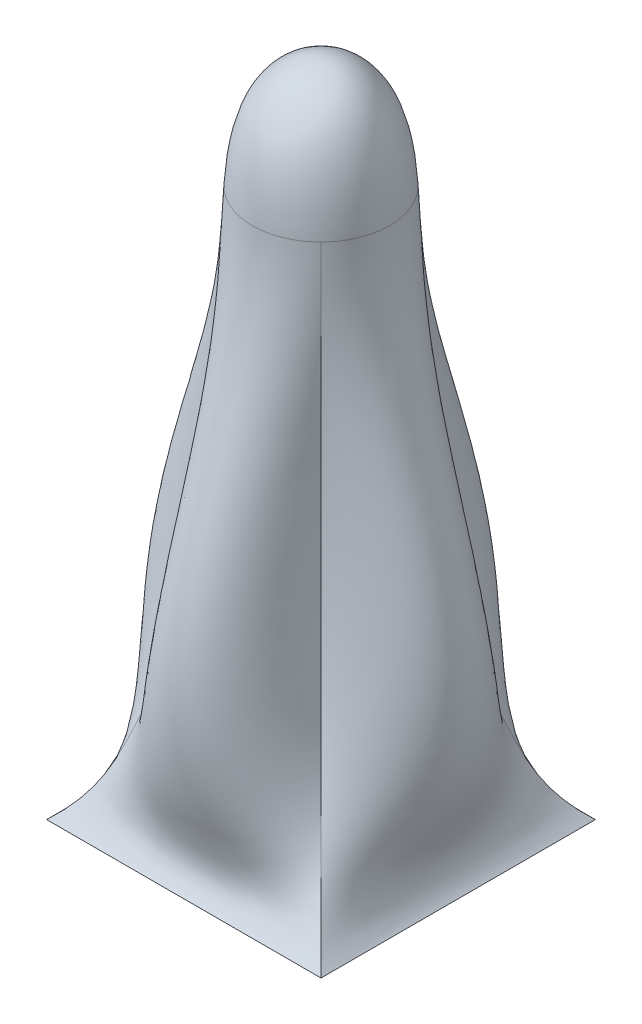
ISO-10303-21;
HEADER;
FILE_DESCRIPTION(('STEP AP214'),'2;1');
FILE_NAME('part.step','',(''),(''),'','','');
FILE_SCHEMA(('AUTOMOTIVE_DESIGN { 1 0 10303 214 1 1 1 1 }'));
ENDSEC;
DATA;
#1=APPLICATION_CONTEXT('core data for automotive mechanical design processes');
#2=APPLICATION_PROTOCOL_DEFINITION('international standard','automotive_design',2000,#1);
#3=PRODUCT_CONTEXT('',#1,'mechanical');
#4=PRODUCT('Part','Part','',(#3));
#5=PRODUCT_RELATED_PRODUCT_CATEGORY('part','',(#4));
#6=PRODUCT_DEFINITION_FORMATION('','',#4);
#7=PRODUCT_DEFINITION_CONTEXT('part definition',#1,'design');
#8=PRODUCT_DEFINITION('design','',#6,#7);
#9=PRODUCT_DEFINITION_SHAPE('','',#8);
#10=(LENGTH_UNIT() NAMED_UNIT(*) SI_UNIT(.MILLI.,.METRE.));
#11=(NAMED_UNIT(*) PLANE_ANGLE_UNIT() SI_UNIT($,.RADIAN.));
#12=(NAMED_UNIT(*) SI_UNIT($,.STERADIAN.) SOLID_ANGLE_UNIT());
#13=UNCERTAINTY_MEASURE_WITH_UNIT(LENGTH_MEASURE(1.E-05),#10,'distance_accuracy_value','');
#14=(GEOMETRIC_REPRESENTATION_CONTEXT(3) GLOBAL_UNCERTAINTY_ASSIGNED_CONTEXT((#13)) GLOBAL_UNIT_ASSIGNED_CONTEXT((#10,
#11,#12)) REPRESENTATION_CONTEXT('',''));
#15=CARTESIAN_POINT('',(0.,0.,0.));
#16=DIRECTION('',(0.,0.,1.));
#17=DIRECTION('',(1.,0.,0.));
#18=AXIS2_PLACEMENT_3D('',#15,#16,#17);
#19=CARTESIAN_POINT('',(0.,0.,0.));
#20=DIRECTION('',(0.,-1.,0.));
#21=DIRECTION('',(0.,0.,-1.));
#22=AXIS2_PLACEMENT_3D('',#19,#20,#21);
#23=PLANE('',#22);
#24=DIRECTION('',(0.,0.,-1.));
#25=VECTOR('',#24,1.);
#26=CARTESIAN_POINT('',(6.35,0.,6.35));
#27=LINE('',#26,#25);
#28=CARTESIAN_POINT('',(6.35,0.,6.35));
#29=VERTEX_POINT('',#28);
#30=CARTESIAN_POINT('',(6.35,0.,-6.35));
#31=VERTEX_POINT('',#30);
#32=EDGE_CURVE('E232',#29,#31,#27,.T.);
#33=ORIENTED_EDGE('',*,*,#32,.F.);
#34=DIRECTION('',(1.,0.,0.));
#35=VECTOR('',#34,1.);
#36=CARTESIAN_POINT('',(-6.35,0.,6.35));
#37=LINE('',#36,#35);
#38=CARTESIAN_POINT('',(-6.35,0.,6.35));
#39=VERTEX_POINT('',#38);
#40=EDGE_CURVE('E214',#39,#29,#37,.T.);
#41=ORIENTED_EDGE('',*,*,#40,.F.);
#42=DIRECTION('',(0.,0.,1.));
#43=VECTOR('',#42,1.);
#44=CARTESIAN_POINT('',(-6.35,0.,6.35));
#45=LINE('',#44,#43);
#46=CARTESIAN_POINT('',(-6.35,0.,-6.35));
#47=VERTEX_POINT('',#46);
#48=EDGE_CURVE('E206',#47,#39,#45,.T.);
#49=ORIENTED_EDGE('',*,*,#48,.F.);
#50=DIRECTION('',(-1.,0.,0.));
#51=VECTOR('',#50,1.);
#52=CARTESIAN_POINT('',(-6.35,0.,-6.35));
#53=LINE('',#52,#51);
#54=EDGE_CURVE('E210',#31,#47,#53,.T.);
#55=ORIENTED_EDGE('',*,*,#54,.F.);
#56=EDGE_LOOP('',(#33,#41,#49,#55));
#57=FACE_BOUND('',#56,.T.);
#58=ADVANCED_FACE('F161',(#57),#23,.T.);
#59=CARTESIAN_POINT('',(-6.35,0.,6.35));
#60=CARTESIAN_POINT('',(-5.30330193062769,0.920473673417694,5.30330193062769));
#61=CARTESIAN_POINT('',(-2.14481905701201,8.9175110041226,2.14481905701201));
#62=CARTESIAN_POINT('',(-2.56812426062388,17.853807006751,2.56812426062387));
#63=CARTESIAN_POINT('',(-2.24723349499428,25.4,2.24723349499428));
#64=CARTESIAN_POINT('',(-2.11666666666667,0.,6.35));
#65=CARTESIAN_POINT('',(-1.76776731020923,0.920473673417694,5.30330193062769));
#66=CARTESIAN_POINT('',(-2.83613051937453,8.9175110041226,12.3469990799866));
#67=CARTESIAN_POINT('',(-1.11391518684819,17.853807006751,3.80840615731316));
#68=CARTESIAN_POINT('',(-1.00695159830499,25.4,3.48751539168357));
#69=CARTESIAN_POINT('',(2.11666666666667,0.,6.35));
#70=CARTESIAN_POINT('',(1.76776731020923,0.920473673417694,5.30330193062769));
#71=CARTESIAN_POINT('',(2.83613051937451,8.9175110041226,12.3469990799866));
#72=CARTESIAN_POINT('',(1.11391518684819,17.853807006751,3.80840615731317));
#73=CARTESIAN_POINT('',(1.00695159830499,25.4,3.48751539168357));
#74=CARTESIAN_POINT('',(6.35,0.,6.35));
#75=CARTESIAN_POINT('',(5.30330193062769,0.920473673417694,5.30330193062769));
#76=CARTESIAN_POINT('',(2.14481905701201,8.9175110041226,2.14481905701201));
#77=CARTESIAN_POINT('',(2.56812426062387,17.853807006751,2.56812426062388));
#78=CARTESIAN_POINT('',(2.24723349499428,25.4,2.24723349499428));
#79=B_SPLINE_SURFACE_WITH_KNOTS('',3,3,((#59,#60,#61,#62,#63),(#64,#65,#66,#67,#68),(#69,#70,
#71,#72,#73),(#74,#75,#76,#77,#78)),.UNSPECIFIED.,.F.,.F.,.F.,(4,4),(4,1,4),(0.,1.),(0.,
0.139812166050217,1.),.UNSPECIFIED.);
#80=CARTESIAN_POINT('',(6.35,0.,6.35));
#81=CARTESIAN_POINT('',(5.30330193062769,0.920473673417694,5.30330193062769));
#82=CARTESIAN_POINT('',(2.14481905701201,8.9175110041226,2.14481905701201));
#83=CARTESIAN_POINT('',(2.56812426062387,17.853807006751,2.56812426062388));
#84=CARTESIAN_POINT('',(2.24723349499428,25.4,2.24723349499428));
#85=B_SPLINE_CURVE_WITH_KNOTS('',3,(#80,#81,#82,#83,#84),.UNSPECIFIED.,.F.,.F.,(4,1,4),(0.,
0.139812166050217,1.),.UNSPECIFIED.);
#86=CARTESIAN_POINT('',(2.24730705049781,25.4000230410495,2.24730705145861));
#87=VERTEX_POINT('',#86);
#88=EDGE_CURVE('E239',#29,#87,#85,.T.);
#89=CARTESIAN_POINT('',(0.,25.4,0.));
#90=DIRECTION('',(0.,1.,0.));
#91=DIRECTION('',(0.,0.,1.));
#92=AXIS2_PLACEMENT_3D('',#89,#90,#91);
#93=CIRCLE('',#92,3.17806808644);
#94=CARTESIAN_POINT('',(-2.24730705060792,25.4000230410994,2.24730705136029));
#95=VERTEX_POINT('',#94);
#96=EDGE_CURVE('E174',#95,#87,#93,.T.);
#97=CARTESIAN_POINT('',(-6.35,0.,6.35));
#98=CARTESIAN_POINT('',(-5.30330193062769,0.920473673417694,5.30330193062769));
#99=CARTESIAN_POINT('',(-2.14481905701201,8.9175110041226,2.14481905701201));
#100=CARTESIAN_POINT('',(-2.56812426062388,17.853807006751,2.56812426062387));
#101=CARTESIAN_POINT('',(-2.24723349499428,25.4,2.24723349499428));
#102=B_SPLINE_CURVE_WITH_KNOTS('',3,(#97,#98,#99,#100,#101),.UNSPECIFIED.,.F.,.F.,(4,1,4),(0.,
0.139812166050217,1.),.UNSPECIFIED.);
#103=EDGE_CURVE('E378',#95,#39,#102,.F.);
#104=ORIENTED_EDGE('',*,*,#40,.T.);
#105=ORIENTED_EDGE('',*,*,#88,.T.);
#106=ORIENTED_EDGE('',*,*,#96,.F.);
#107=ORIENTED_EDGE('',*,*,#103,.T.);
#108=EDGE_LOOP('',(#104,#105,#106,#107));
#109=FACE_BOUND('',#108,.T.);
#110=ADVANCED_FACE('F354',(#109),#79,.T.);
#111=CARTESIAN_POINT('',(6.35,0.,6.35));
#112=CARTESIAN_POINT('',(5.30330193062769,0.920473673417694,5.30330193062769));
#113=CARTESIAN_POINT('',(2.14481905701201,8.9175110041226,2.14481905701201));
#114=CARTESIAN_POINT('',(2.56812426062387,17.853807006751,2.56812426062387));
#115=CARTESIAN_POINT('',(2.24723349499428,25.4,2.24723349499428));
#116=CARTESIAN_POINT('',(6.35,0.,2.11666666666667));
#117=CARTESIAN_POINT('',(5.30330193062769,0.920473673417694,1.76776731020923));
#118=CARTESIAN_POINT('',(12.3469990799866,8.9175110041226,2.83613051937452));
#119=CARTESIAN_POINT('',(3.80840615731317,17.853807006751,1.11391518684819));
#120=CARTESIAN_POINT('',(3.48751539168357,25.4,1.00695159830499));
#121=CARTESIAN_POINT('',(6.35,0.,-2.11666666666667));
#122=CARTESIAN_POINT('',(5.30330193062769,0.920473673417694,-1.76776731020923));
#123=CARTESIAN_POINT('',(12.3469990799866,8.9175110041226,-2.83613051937452));
#124=CARTESIAN_POINT('',(3.80840615731317,17.853807006751,-1.11391518684819));
#125=CARTESIAN_POINT('',(3.48751539168357,25.4,-1.00695159830499));
#126=CARTESIAN_POINT('',(6.35,0.,-6.35));
#127=CARTESIAN_POINT('',(5.30330193062769,0.920473673417694,-5.30330193062769));
#128=CARTESIAN_POINT('',(2.14481905701201,8.9175110041226,-2.14481905701201));
#129=CARTESIAN_POINT('',(2.56812426062387,17.853807006751,-2.56812426062387));
#130=CARTESIAN_POINT('',(2.24723349499428,25.4,-2.24723349499428));
#131=B_SPLINE_SURFACE_WITH_KNOTS('',3,3,((#111,#112,#113,#114,#115),(#116,#117,#118,#119,#120),
(#121,#122,#123,#124,#125),(#126,#127,#128,#129,#130)),.UNSPECIFIED.,.F.,.F.,.F.,(4,4),(4,1,4),
(0.,1.),(0.,0.139812166050217,1.),.UNSPECIFIED.);
#132=CARTESIAN_POINT('',(6.35,0.,-6.35));
#133=CARTESIAN_POINT('',(5.30330193062769,0.920473673417694,-5.30330193062769));
#134=CARTESIAN_POINT('',(2.14481905701201,8.9175110041226,-2.14481905701201));
#135=CARTESIAN_POINT('',(2.56812426062387,17.853807006751,-2.56812426062387));
#136=CARTESIAN_POINT('',(2.24723349499428,25.4,-2.24723349499428));
#137=B_SPLINE_CURVE_WITH_KNOTS('',3,(#132,#133,#134,#135,#136),.UNSPECIFIED.,.F.,.F.,(4,1,4),
(0.,0.139812166050217,1.),.UNSPECIFIED.);
#138=CARTESIAN_POINT('',(2.24730705087547,25.40002304108,-2.24730705171474));
#139=VERTEX_POINT('',#138);
#140=EDGE_CURVE('E231',#31,#139,#137,.T.);
#141=EDGE_CURVE('E182',#87,#139,#93,.T.);
#142=ORIENTED_EDGE('',*,*,#32,.T.);
#143=ORIENTED_EDGE('',*,*,#140,.T.);
#144=ORIENTED_EDGE('',*,*,#141,.F.);
#145=ORIENTED_EDGE('',*,*,#88,.F.);
#146=EDGE_LOOP('',(#142,#143,#144,#145));
#147=FACE_BOUND('',#146,.T.);
#148=ADVANCED_FACE('F266',(#147),#131,.T.);
#149=CARTESIAN_POINT('',(-6.35,0.,-6.35));
#150=CARTESIAN_POINT('',(-5.30330193062769,0.920473673417694,-5.30330193062769));
#151=CARTESIAN_POINT('',(-2.14481905701201,8.9175110041226,-2.14481905701201));
#152=CARTESIAN_POINT('',(-2.56812426062387,17.853807006751,-2.56812426062387));
#153=CARTESIAN_POINT('',(-2.24723349499428,25.4,-2.24723349499428));
#154=CARTESIAN_POINT('',(-6.35,0.,-2.11666666666667));
#155=CARTESIAN_POINT('',(-5.30330193062769,0.920473673417694,-1.76776731020923));
#156=CARTESIAN_POINT('',(-12.3469990799866,8.9175110041226,-2.83613051937453));
#157=CARTESIAN_POINT('',(-3.80840615731316,17.853807006751,-1.11391518684819));
#158=CARTESIAN_POINT('',(-3.48751539168357,25.4,-1.00695159830499));
#159=CARTESIAN_POINT('',(-6.35,0.,2.11666666666667));
#160=CARTESIAN_POINT('',(-5.30330193062769,0.920473673417694,1.76776731020923));
#161=CARTESIAN_POINT('',(-12.3469990799866,8.9175110041226,2.83613051937452));
#162=CARTESIAN_POINT('',(-3.80840615731317,17.853807006751,1.11391518684819));
#163=CARTESIAN_POINT('',(-3.48751539168357,25.4,1.00695159830499));
#164=CARTESIAN_POINT('',(-6.35,0.,6.35));
#165=CARTESIAN_POINT('',(-5.30330193062769,0.920473673417694,5.30330193062769));
#166=CARTESIAN_POINT('',(-2.14481905701201,8.9175110041226,2.14481905701201));
#167=CARTESIAN_POINT('',(-2.56812426062387,17.853807006751,2.56812426062387));
#168=CARTESIAN_POINT('',(-2.24723349499428,25.4,2.24723349499428));
#169=B_SPLINE_SURFACE_WITH_KNOTS('',3,3,((#149,#150,#151,#152,#153),(#154,#155,#156,#157,#158),
(#159,#160,#161,#162,#163),(#164,#165,#166,#167,#168)),.UNSPECIFIED.,.F.,.F.,.F.,(4,4),(4,1,4),
(0.,1.),(0.,0.139812166050217,1.),.UNSPECIFIED.);
#170=CARTESIAN_POINT('',(-2.24730705002461,25.4000230411129,-2.2473070511366));
#171=VERTEX_POINT('',#170);
#172=EDGE_CURVE('E13',#171,#95,#93,.T.);
#173=CARTESIAN_POINT('',(-6.35,0.,-6.35));
#174=CARTESIAN_POINT('',(-5.30330193062769,0.920473673417694,-5.30330193062769));
#175=CARTESIAN_POINT('',(-2.14481905701201,8.9175110041226,-2.14481905701201));
#176=CARTESIAN_POINT('',(-2.56812426062387,17.853807006751,-2.56812426062387));
#177=CARTESIAN_POINT('',(-2.24723349499428,25.4,-2.24723349499428));
#178=B_SPLINE_CURVE_WITH_KNOTS('',3,(#173,#174,#175,#176,#177),.UNSPECIFIED.,.F.,.F.,(4,1,4),
(0.,0.139812166050217,1.),.UNSPECIFIED.);
#179=EDGE_CURVE('E228',#47,#171,#178,.T.);
#180=ORIENTED_EDGE('',*,*,#48,.T.);
#181=ORIENTED_EDGE('',*,*,#103,.F.);
#182=ORIENTED_EDGE('',*,*,#172,.F.);
#183=ORIENTED_EDGE('',*,*,#179,.F.);
#184=EDGE_LOOP('',(#180,#181,#182,#183));
#185=FACE_BOUND('',#184,.T.);
#186=ADVANCED_FACE('F236',(#185),#169,.T.);
#187=CARTESIAN_POINT('',(6.35,0.,-6.35));
#188=CARTESIAN_POINT('',(5.30330193062769,0.920473673417694,-5.30330193062769));
#189=CARTESIAN_POINT('',(2.14481905701201,8.9175110041226,-2.14481905701201));
#190=CARTESIAN_POINT('',(2.56812426062387,17.853807006751,-2.56812426062387));
#191=CARTESIAN_POINT('',(2.24723349499428,25.4,-2.24723349499428));
#192=CARTESIAN_POINT('',(2.11666666666667,0.,-6.35));
#193=CARTESIAN_POINT('',(1.76776731020923,0.920473673417694,-5.30330193062769));
#194=CARTESIAN_POINT('',(2.83613051937452,8.9175110041226,-12.3469990799866));
#195=CARTESIAN_POINT('',(1.11391518684819,17.853807006751,-3.80840615731316));
#196=CARTESIAN_POINT('',(1.00695159830499,25.4,-3.48751539168357));
#197=CARTESIAN_POINT('',(-2.11666666666667,0.,-6.35));
#198=CARTESIAN_POINT('',(-1.76776731020923,0.920473673417694,-5.30330193062769));
#199=CARTESIAN_POINT('',(-2.83613051937452,8.9175110041226,-12.3469990799866));
#200=CARTESIAN_POINT('',(-1.11391518684819,17.853807006751,-3.80840615731317));
#201=CARTESIAN_POINT('',(-1.00695159830499,25.4,-3.48751539168357));
#202=CARTESIAN_POINT('',(-6.35,0.,-6.35));
#203=CARTESIAN_POINT('',(-5.30330193062769,0.920473673417694,-5.30330193062769));
#204=CARTESIAN_POINT('',(-2.14481905701201,8.9175110041226,-2.14481905701201));
#205=CARTESIAN_POINT('',(-2.56812426062387,17.853807006751,-2.56812426062387));
#206=CARTESIAN_POINT('',(-2.24723349499428,25.4,-2.24723349499428));
#207=B_SPLINE_SURFACE_WITH_KNOTS('',3,3,((#187,#188,#189,#190,#191),(#192,#193,#194,#195,#196),
(#197,#198,#199,#200,#201),(#202,#203,#204,#205,#206)),.UNSPECIFIED.,.F.,.F.,.F.,(4,4),(4,1,4),
(0.,1.),(0.,0.139812166050217,1.),.UNSPECIFIED.);
#208=EDGE_CURVE('E168',#139,#171,#93,.T.);
#209=ORIENTED_EDGE('',*,*,#54,.T.);
#210=ORIENTED_EDGE('',*,*,#179,.T.);
#211=ORIENTED_EDGE('',*,*,#208,.F.);
#212=ORIENTED_EDGE('',*,*,#140,.F.);
#213=EDGE_LOOP('',(#209,#210,#211,#212));
#214=FACE_BOUND('',#213,.T.);
#215=ADVANCED_FACE('F227',(#214),#207,.T.);
#216=CARTESIAN_POINT('',(-2.10781537404731,19.5422137696756,-2.10781534897208));
#217=CARTESIAN_POINT('',(-2.04167385908674,21.7421905653548,-2.44227441676807));
#218=CARTESIAN_POINT('',(-1.77322312130555,23.3892741672306,-2.75154107050886));
#219=CARTESIAN_POINT('',(-1.278842944344,24.4854543210965,-3.04273143319363));
#220=CARTESIAN_POINT('',(-1.75674963152813E-09,25.5808918992277,-3.33613684305719));
#221=CARTESIAN_POINT('',(1.27884294281664,24.4854543215289,-3.04273144170387));
#222=CARTESIAN_POINT('',(1.77322312168132,23.3892741667935,-2.75154108557143));
#223=CARTESIAN_POINT('',(2.04167384643083,21.7421905644646,-2.44227442396847));
#224=CARTESIAN_POINT('',(2.10781534897077,19.5422137696786,-2.10781537404723));
#225=CARTESIAN_POINT('',(-2.44227442620045,21.7421905646299,-2.04167384706764));
#226=CARTESIAN_POINT('',(-2.36658326965616,23.9425949619969,-2.36658310423494));
#227=CARTESIAN_POINT('',(-2.0661165452177,25.5889061358893,-2.67158563550752));
#228=CARTESIAN_POINT('',(-1.49925171771107,26.6839748955734,-2.98817103016982));
#229=CARTESIAN_POINT('',(2.77669754646106E-08,27.7769557428394,-3.28900426085524));
#230=CARTESIAN_POINT('',(1.49925170902399,26.6839748970368,-2.98817107787482));
#231=CARTESIAN_POINT('',(2.06611652279446,25.5889061367855,-2.67158554723464));
#232=CARTESIAN_POINT('',(2.36658328060818,23.9425949585671,-2.36658315352602));
#233=CARTESIAN_POINT('',(2.44227441706159,21.7421905648289,-2.0416738693534));
#234=CARTESIAN_POINT('',(-2.75154107896114,23.3892741692531,-1.77322311769245));
#235=CARTESIAN_POINT('',(-2.67158557363497,25.5889061348277,-2.06611660865166));
#236=CARTESIAN_POINT('',(-2.35937928147234,27.232830493184,-2.35937940347848));
#237=CARTESIAN_POINT('',(-1.72924445128461,28.3271105828715,-2.68118660098574));
#238=CARTESIAN_POINT('',(1.45460851929338E-08,29.4133091580847,-2.93122348248237));
#239=CARTESIAN_POINT('',(1.72924442751595,28.3271105849388,-2.68118653739701));
#240=CARTESIAN_POINT('',(2.35937934291022,27.2328304909542,-2.35937940932199));
#241=CARTESIAN_POINT('',(2.67158555020882,25.5889061372742,-2.06611664320561));
#242=CARTESIAN_POINT('',(2.75154107291992,23.389274169116,-1.77322312791659));
#243=CARTESIAN_POINT('',(-3.0427314512824,24.4854543188692,-1.27884291484716));
#244=CARTESIAN_POINT('',(-2.98817099222025,26.6839748923665,-1.49925172514081));
#245=CARTESIAN_POINT('',(-2.68118664752679,28.327110589906,-1.72924442706452));
#246=CARTESIAN_POINT('',(-1.89901107368769,29.402730223771,-1.89901105806335));
#247=CARTESIAN_POINT('',(2.08984497188014E-08,30.4876359765875,-2.11438298035684));
#248=CARTESIAN_POINT('',(1.89901104776503,29.4027302229523,-1.89901100266634));
#249=CARTESIAN_POINT('',(2.68118667394078,28.3271105899751,-1.72924451691845));
#250=CARTESIAN_POINT('',(2.9881710298386,26.6839748932671,-1.49925164854341));
#251=CARTESIAN_POINT('',(3.04273143506965,24.485454320297,-1.27884288578039));
#252=CARTESIAN_POINT('',(-3.33613681593119,25.5808919032794,8.3698194225749E-10));
#253=CARTESIAN_POINT('',(-3.2890043575534,27.7769557564567,-4.92004194629174E-08));
#254=CARTESIAN_POINT('',(-2.9312233764641,29.4133091367166,6.60634891920993E-08));
#255=CARTESIAN_POINT('',(-2.11438292634616,30.4876359847783,-5.87812731050352E-08));
#256=CARTESIAN_POINT('',(-4.53203266975668E-08,31.5419978091741,1.40125021211161E-07));
#257=CARTESIAN_POINT('',(2.11438300852908,30.4876359810446,-2.14163694983445E-07));
#258=CARTESIAN_POINT('',(2.93122336189969,29.4133091492604,3.17815292034733E-07));
#259=CARTESIAN_POINT('',(3.28900430120164,27.7769557465053,-1.30172720657577E-07));
#260=CARTESIAN_POINT('',(3.33613683650227,25.5808919008184,-4.57196545227282E-08));
#261=CARTESIAN_POINT('',(-3.0427314450953,24.4854543191178,1.27884291681534));
#262=CARTESIAN_POINT('',(-2.9881710916357,26.6839748885531,1.49925177158967));
#263=CARTESIAN_POINT('',(-2.6811865942827,28.3271105967954,1.72924433123723));
#264=CARTESIAN_POINT('',(-1.89901104669424,29.4027302164534,1.89901112529495));
#265=CARTESIAN_POINT('',(3.556596640289E-08,30.4876359873119,2.11438282453175));
#266=CARTESIAN_POINT('',(1.89901097524289,29.4027302194216,1.8990112310514));
#267=CARTESIAN_POINT('',(2.68118658712687,28.3271105899655,1.72924419532422));
#268=CARTESIAN_POINT('',(2.98817111856488,26.6839748930239,1.49925180003123));
#269=CARTESIAN_POINT('',(3.04273143732596,24.4854543199371,1.27884293374593));
#270=CARTESIAN_POINT('',(-2.75154106769027,23.3892741690453,1.77322311804419));
#271=CARTESIAN_POINT('',(-2.67158541037472,25.5889061403829,2.06611657110987));
#272=CARTESIAN_POINT('',(-2.35937940409425,27.2328304829339,2.35937944694679));
#273=CARTESIAN_POINT('',(-1.72924458385954,28.3271105941067,2.68118651935054));
#274=CARTESIAN_POINT('',(-1.38368721639949E-08,29.4133091426389,2.93122359764534));
#275=CARTESIAN_POINT('',(1.72924461602275,28.3271105890727,2.68118642346922));
#276=CARTESIAN_POINT('',(2.3593793609378,27.2328304909123,2.3593796446797));
#277=CARTESIAN_POINT('',(2.67158540916256,25.5889061381584,2.06611653805802));
#278=CARTESIAN_POINT('',(2.75154109385748,23.3892741684278,1.77322310454692));
#279=CARTESIAN_POINT('',(-2.4422744145398,21.7421905651995,2.04167385971925));
#280=CARTESIAN_POINT('',(-2.36658322704736,23.9425949614552,2.36658311384349));
#281=CARTESIAN_POINT('',(-2.0661166592608,25.5889061356563,2.67158564803092));
#282=CARTESIAN_POINT('',(-1.49925158629572,26.6839748941339,2.98817103575926));
#283=CARTESIAN_POINT('',(-2.51028878241672E-08,27.7769557471461,3.28900421591473));
#284=CARTESIAN_POINT('',(1.49925159482832,26.6839748967774,2.98817111504288));
#285=CARTESIAN_POINT('',(2.06611667657686,25.5889061296785,2.6715855142922));
#286=CARTESIAN_POINT('',(2.36658321609395,23.9425949621146,2.36658314391602));
#287=CARTESIAN_POINT('',(2.44227442367143,21.7421905650076,2.04167385670053));
#288=CARTESIAN_POINT('',(-2.10781534897989,19.5422137696872,2.10781537404023));
#289=CARTESIAN_POINT('',(-2.04167388547159,21.7421905645808,2.4422744261717));
#290=CARTESIAN_POINT('',(-1.77322309987676,23.3892741685975,2.75154108156688));
#291=CARTESIAN_POINT('',(-1.27884288553556,24.4854543221357,3.04273143749259));
#292=CARTESIAN_POINT('',(8.98443590235942E-10,25.580891897625,3.33613684966532));
#293=CARTESIAN_POINT('',(1.27884288737507,24.4854543214642,3.04273143089588));
#294=CARTESIAN_POINT('',(1.77322309946462,23.3892741698279,2.75154106764111));
#295=CARTESIAN_POINT('',(2.04167389812228,21.7421905652639,2.44227441456184));
#296=CARTESIAN_POINT('',(2.107815374045,19.5422137696979,2.10781534897607));
#297=B_SPLINE_SURFACE_WITH_KNOTS('',5,5,((#216,#217,#218,#219,#220,#221,#222,#223,#224),(#225,
#226,#227,#228,#229,#230,#231,#232,#233),(#234,#235,#236,#237,#238,#239,#240,#241,#242),(#243,
#244,#245,#246,#247,#248,#249,#250,#251),(#252,#253,#254,#255,#256,#257,#258,#259,#260),(#261,
#262,#263,#264,#265,#266,#267,#268,#269),(#270,#271,#272,#273,#274,#275,#276,#277,#278),(#279,
#280,#281,#282,#283,#284,#285,#286,#287),(#288,#289,#290,#291,#292,#293,#294,#295,#296)),
.UNSPECIFIED.,.F.,.F.,.F.,(6,3,6),(6,3,6),(-3.28941439925013,-6.47037978751541E-13,
3.28941439924884),(-3.28941439924921,0.,3.28941439924927),.UNSPECIFIED.);
#298=ORIENTED_EDGE('',*,*,#208,.T.);
#299=ORIENTED_EDGE('',*,*,#172,.T.);
#300=ORIENTED_EDGE('',*,*,#96,.T.);
#301=ORIENTED_EDGE('',*,*,#141,.T.);
#302=EDGE_LOOP('',(#298,#299,#300,#301));
#303=FACE_BOUND('',#302,.T.);
#304=ADVANCED_FACE('F163',(#303),#297,.T.);
#305=CLOSED_SHELL('',(#58,#110,#148,#186,#215,#304));
#306=MANIFOLD_SOLID_BREP('B2',#305);
#307=ADVANCED_BREP_SHAPE_REPRESENTATION('',(#18,#306),#14);
#308=SHAPE_DEFINITION_REPRESENTATION(#9,#307);
ENDSEC;
END-ISO-10303-21;
